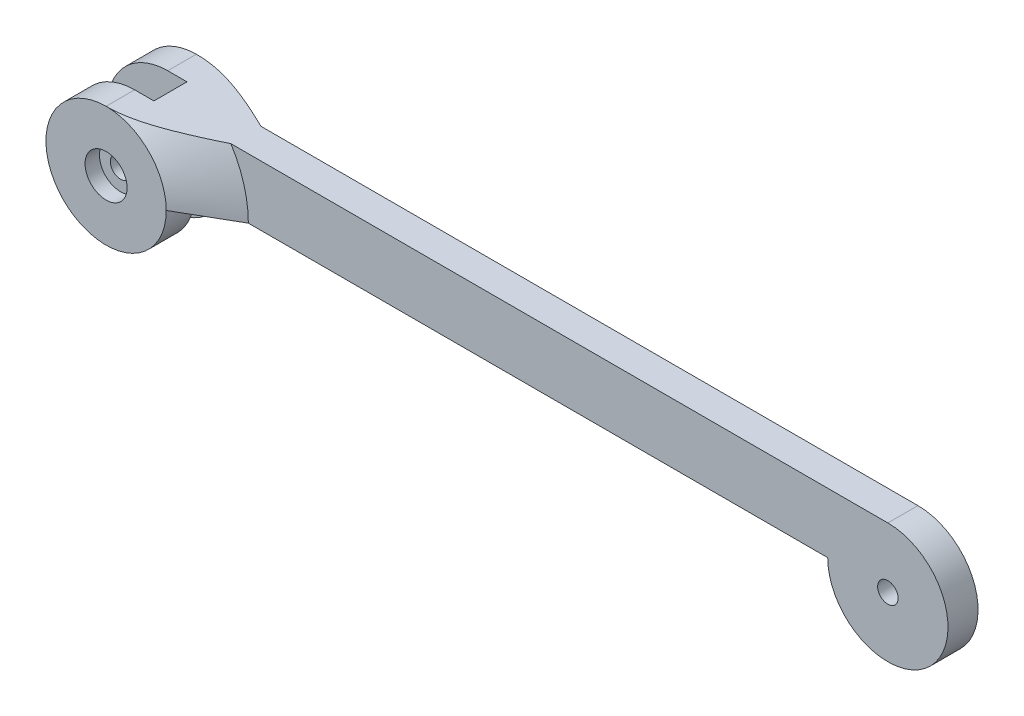
ISO-10303-21;
HEADER;
FILE_DESCRIPTION(('STEP AP214'),'2;1');
FILE_NAME('part.step','',(''),(''),'','','');
FILE_SCHEMA(('AUTOMOTIVE_DESIGN { 1 0 10303 214 1 1 1 1 }'));
ENDSEC;
DATA;
#1=APPLICATION_CONTEXT('core data for automotive mechanical design processes');
#2=APPLICATION_PROTOCOL_DEFINITION('international standard','automotive_design',2000,#1);
#3=PRODUCT_CONTEXT('',#1,'mechanical');
#4=PRODUCT('Part','Part','',(#3));
#5=PRODUCT_RELATED_PRODUCT_CATEGORY('part','',(#4));
#6=PRODUCT_DEFINITION_FORMATION('','',#4);
#7=PRODUCT_DEFINITION_CONTEXT('part definition',#1,'design');
#8=PRODUCT_DEFINITION('design','',#6,#7);
#9=PRODUCT_DEFINITION_SHAPE('','',#8);
#10=(LENGTH_UNIT() NAMED_UNIT(*) SI_UNIT(.MILLI.,.METRE.));
#11=(NAMED_UNIT(*) PLANE_ANGLE_UNIT() SI_UNIT($,.RADIAN.));
#12=(NAMED_UNIT(*) SI_UNIT($,.STERADIAN.) SOLID_ANGLE_UNIT());
#13=UNCERTAINTY_MEASURE_WITH_UNIT(LENGTH_MEASURE(1.E-05),#10,'distance_accuracy_value','');
#14=(GEOMETRIC_REPRESENTATION_CONTEXT(3) GLOBAL_UNCERTAINTY_ASSIGNED_CONTEXT((#13)) GLOBAL_UNIT_ASSIGNED_CONTEXT((#10,
#11,#12)) REPRESENTATION_CONTEXT('',''));
#15=CARTESIAN_POINT('',(0.,0.,0.));
#16=DIRECTION('',(0.,0.,1.));
#17=DIRECTION('',(1.,0.,0.));
#18=AXIS2_PLACEMENT_3D('',#15,#16,#17);
#19=CARTESIAN_POINT('',(0.,0.,7.5));
#20=DIRECTION('',(0.,0.,1.));
#21=DIRECTION('',(1.,0.,0.));
#22=AXIS2_PLACEMENT_3D('',#19,#20,#21);
#23=CYLINDRICAL_SURFACE('',#22,1.7);
#24=CARTESIAN_POINT('',(0.,0.,-2.75));
#25=DIRECTION('',(0.,0.,1.));
#26=DIRECTION('',(1.,0.,0.));
#27=AXIS2_PLACEMENT_3D('',#24,#25,#26);
#28=CIRCLE('',#27,1.7);
#29=CARTESIAN_POINT('',(1.7,0.,-2.75));
#30=VERTEX_POINT('',#29);
#31=EDGE_CURVE('E216',#30,#30,#28,.T.);
#32=ORIENTED_EDGE('',*,*,#31,.T.);
#33=EDGE_LOOP('',(#32));
#34=FACE_BOUND('',#33,.T.);
#35=CARTESIAN_POINT('',(0.,0.,-4.5));
#36=DIRECTION('',(0.,0.,-1.));
#37=DIRECTION('',(-1.,0.,0.));
#38=AXIS2_PLACEMENT_3D('',#35,#36,#37);
#39=CIRCLE('',#38,1.7);
#40=CARTESIAN_POINT('',(-1.7,0.,-4.5));
#41=VERTEX_POINT('',#40);
#42=EDGE_CURVE('E38',#41,#41,#39,.F.);
#43=ORIENTED_EDGE('',*,*,#42,.F.);
#44=EDGE_LOOP('',(#43));
#45=FACE_BOUND('',#44,.T.);
#46=ADVANCED_FACE('F33',(#34,#45),#23,.F.);
#47=CARTESIAN_POINT('',(0.,0.,2.5));
#48=DIRECTION('',(0.,0.,-1.));
#49=DIRECTION('',(-1.,0.,0.));
#50=AXIS2_PLACEMENT_3D('',#47,#48,#49);
#51=CYLINDRICAL_SURFACE('',#50,10.);
#52=CARTESIAN_POINT('',(0.,0.,-2.75));
#53=DIRECTION('',(0.,0.,1.));
#54=DIRECTION('',(1.,0.,0.));
#55=AXIS2_PLACEMENT_3D('',#52,#53,#54);
#56=CIRCLE('',#55,10.);
#57=CARTESIAN_POINT('',(0.,10.,-2.75));
#58=VERTEX_POINT('',#57);
#59=CARTESIAN_POINT('',(10.,0.,-2.75));
#60=VERTEX_POINT('',#59);
#61=EDGE_CURVE('E229',#58,#60,#56,.T.);
#62=ORIENTED_EDGE('',*,*,#61,.F.);
#63=DIRECTION('',(0.,0.,-1.));
#64=VECTOR('',#63,1.);
#65=CARTESIAN_POINT('',(0.,10.,2.5));
#66=LINE('',#65,#64);
#67=CARTESIAN_POINT('',(0.,10.,-7.5));
#68=VERTEX_POINT('',#67);
#69=EDGE_CURVE('E253',#58,#68,#66,.T.);
#70=ORIENTED_EDGE('',*,*,#69,.T.);
#71=CARTESIAN_POINT('',(0.,0.,-7.5));
#72=DIRECTION('',(0.,0.,1.));
#73=DIRECTION('',(1.,0.,0.));
#74=AXIS2_PLACEMENT_3D('',#71,#72,#73);
#75=CIRCLE('',#74,10.);
#76=CARTESIAN_POINT('',(10.,0.,-7.5));
#77=VERTEX_POINT('',#76);
#78=EDGE_CURVE('E236',#68,#77,#75,.T.);
#79=ORIENTED_EDGE('',*,*,#78,.T.);
#80=DIRECTION('',(0.,0.,-1.));
#81=VECTOR('',#80,1.);
#82=CARTESIAN_POINT('',(10.,0.,2.5));
#83=LINE('',#82,#81);
#84=EDGE_CURVE('E268',#60,#77,#83,.T.);
#85=ORIENTED_EDGE('',*,*,#84,.F.);
#86=EDGE_LOOP('',(#62,#70,#79,#85));
#87=FACE_BOUND('',#86,.T.);
#88=ADVANCED_FACE('F304',(#87),#51,.T.);
#89=CARTESIAN_POINT('',(10.,0.,2.5));
#90=DIRECTION('',(0.,1.,0.));
#91=DIRECTION('',(-1.,0.,0.));
#92=AXIS2_PLACEMENT_3D('',#89,#90,#91);
#93=PLANE('',#92);
#94=DIRECTION('',(1.,0.,0.));
#95=VECTOR('',#94,1.);
#96=CARTESIAN_POINT('',(10.,0.,-2.75));
#97=LINE('',#96,#95);
#98=CARTESIAN_POINT('',(10.5,0.,-2.75));
#99=VERTEX_POINT('',#98);
#100=EDGE_CURVE('E231',#60,#99,#97,.T.);
#101=ORIENTED_EDGE('',*,*,#100,.F.);
#102=ORIENTED_EDGE('',*,*,#84,.T.);
#103=DIRECTION('',(-0.866025403784441,0.,-0.499999999999996));
#104=VECTOR('',#103,1.);
#105=CARTESIAN_POINT('',(0.,0.,-13.2735026918963));
#106=LINE('',#105,#104);
#107=CARTESIAN_POINT('',(18.6602540378446,0.,-2.5));
#108=VERTEX_POINT('',#107);
#109=EDGE_CURVE('E277',#77,#108,#106,.F.);
#110=ORIENTED_EDGE('',*,*,#109,.T.);
#111=DIRECTION('',(1.,0.,0.));
#112=VECTOR('',#111,1.);
#113=CARTESIAN_POINT('',(10.,0.,-2.5));
#114=LINE('',#113,#112);
#115=CARTESIAN_POINT('',(115.,0.,-2.5));
#116=VERTEX_POINT('',#115);
#117=EDGE_CURVE('E240',#108,#116,#114,.T.);
#118=ORIENTED_EDGE('',*,*,#117,.T.);
#119=DIRECTION('',(0.,0.,-1.));
#120=VECTOR('',#119,1.);
#121=CARTESIAN_POINT('',(115.,0.,2.5));
#122=LINE('',#121,#120);
#123=CARTESIAN_POINT('',(115.,0.,2.5));
#124=VERTEX_POINT('',#123);
#125=EDGE_CURVE('E265',#124,#116,#122,.T.);
#126=ORIENTED_EDGE('',*,*,#125,.F.);
#127=DIRECTION('',(1.,0.,0.));
#128=VECTOR('',#127,1.);
#129=CARTESIAN_POINT('',(10.,0.,2.5));
#130=LINE('',#129,#128);
#131=CARTESIAN_POINT('',(18.6602540378446,0.,2.5));
#132=VERTEX_POINT('',#131);
#133=EDGE_CURVE('E245',#132,#124,#130,.T.);
#134=ORIENTED_EDGE('',*,*,#133,.F.);
#135=DIRECTION('',(0.866025403784441,0.,-0.499999999999996));
#136=VECTOR('',#135,1.);
#137=CARTESIAN_POINT('',(0.,0.,13.2735026918963));
#138=LINE('',#137,#136);
#139=CARTESIAN_POINT('',(10.,0.,7.5));
#140=VERTEX_POINT('',#139);
#141=EDGE_CURVE('E286',#132,#140,#138,.F.);
#142=ORIENTED_EDGE('',*,*,#141,.T.);
#143=CARTESIAN_POINT('',(10.,0.,2.75));
#144=VERTEX_POINT('',#143);
#145=EDGE_CURVE('E269',#140,#144,#83,.T.);
#146=ORIENTED_EDGE('',*,*,#145,.T.);
#147=DIRECTION('',(1.,0.,0.));
#148=VECTOR('',#147,1.);
#149=CARTESIAN_POINT('',(10.,0.,2.75));
#150=LINE('',#149,#148);
#151=CARTESIAN_POINT('',(10.5,0.,2.75));
#152=VERTEX_POINT('',#151);
#153=EDGE_CURVE('E226',#144,#152,#150,.T.);
#154=ORIENTED_EDGE('',*,*,#153,.T.);
#155=DIRECTION('',(0.,0.,1.));
#156=VECTOR('',#155,1.);
#157=CARTESIAN_POINT('',(10.5,0.,-2.75));
#158=LINE('',#157,#156);
#159=EDGE_CURVE('E233',#152,#99,#158,.F.);
#160=ORIENTED_EDGE('',*,*,#159,.T.);
#161=EDGE_LOOP('',(#101,#102,#110,#118,#126,#134,#142,#146,#154,#160));
#162=FACE_BOUND('',#161,.T.);
#163=ADVANCED_FACE('F305',(#162),#93,.F.);
#164=CARTESIAN_POINT('',(125.,10.,2.5));
#165=DIRECTION('',(0.,-1.,0.));
#166=DIRECTION('',(0.,0.,-1.));
#167=AXIS2_PLACEMENT_3D('',#164,#165,#166);
#168=PLANE('',#167);
#169=DIRECTION('',(-1.,0.,0.));
#170=VECTOR('',#169,1.);
#171=CARTESIAN_POINT('',(125.,10.,-2.75));
#172=LINE('',#171,#170);
#173=CARTESIAN_POINT('',(3.20156211871643,10.,-2.75));
#174=VERTEX_POINT('',#173);
#175=EDGE_CURVE('E11',#174,#58,#172,.T.);
#176=ORIENTED_EDGE('',*,*,#175,.F.);
#177=DIRECTION('',(0.,0.,1.));
#178=VECTOR('',#177,1.);
#179=CARTESIAN_POINT('',(3.20156211871643,10.,-2.75));
#180=LINE('',#179,#178);
#181=CARTESIAN_POINT('',(3.20156211871643,10.,2.75));
#182=VERTEX_POINT('',#181);
#183=EDGE_CURVE('E43',#174,#182,#180,.T.);
#184=ORIENTED_EDGE('',*,*,#183,.T.);
#185=DIRECTION('',(-1.,0.,0.));
#186=VECTOR('',#185,1.);
#187=CARTESIAN_POINT('',(125.,10.,2.75));
#188=LINE('',#187,#186);
#189=CARTESIAN_POINT('',(0.,10.,2.75));
#190=VERTEX_POINT('',#189);
#191=EDGE_CURVE('E345',#182,#190,#188,.T.);
#192=ORIENTED_EDGE('',*,*,#191,.T.);
#193=CARTESIAN_POINT('',(0.,10.,7.5));
#194=VERTEX_POINT('',#193);
#195=EDGE_CURVE('E259',#194,#190,#66,.T.);
#196=ORIENTED_EDGE('',*,*,#195,.F.);
#197=CARTESIAN_POINT('',(0.,10.,7.50000000000006));
#198=CARTESIAN_POINT('',(0.144372162932535,10.,7.50000362350864));
#199=CARTESIAN_POINT('',(0.288738086820741,10.,7.49819440735731));
#200=CARTESIAN_POINT('',(0.577376142951994,10.,7.4909831260463));
#201=CARTESIAN_POINT('',(0.721648277774843,10.,7.48558116429262));
#202=CARTESIAN_POINT('',(1.15408162181387,10.,7.46404186439913));
#203=CARTESIAN_POINT('',(1.44199295926562,10.,7.44257105304319));
#204=CARTESIAN_POINT('',(2.01544575715142,10.,7.38615968915833));
#205=CARTESIAN_POINT('',(2.30099199007253,10.,7.35126673147127));
#206=CARTESIAN_POINT('',(2.87029353254001,10.,7.26898729313719));
#207=CARTESIAN_POINT('',(3.15404867463625,10.,7.22159966156392));
#208=CARTESIAN_POINT('',(3.71649805138243,10.,7.11605950081699));
#209=CARTESIAN_POINT('',(3.99521427935411,10.,7.05802332692339));
#210=CARTESIAN_POINT('',(4.55038271691151,10.,6.93208185523583));
#211=CARTESIAN_POINT('',(4.82683496486458,10.,6.86417672505682));
#212=CARTESIAN_POINT('',(5.6532629489847,10.,6.64734218408917));
#213=CARTESIAN_POINT('',(6.19983849099192,10.,6.48538610894802));
#214=CARTESIAN_POINT('',(7.12743693503927,10.,6.18599092872168));
#215=CARTESIAN_POINT('',(7.51060513694897,10.,6.05501560217946));
#216=CARTESIAN_POINT('',(8.2731149819681,10.,5.78228979844106));
#217=CARTESIAN_POINT('',(8.65245639295167,10.,5.64053867200415));
#218=CARTESIAN_POINT('',(9.40777351320985,10.,5.34827589721092));
#219=CARTESIAN_POINT('',(9.78374886321815,10.,5.197763326292));
#220=CARTESIAN_POINT('',(10.5327609746539,10.,4.88958863879194));
#221=CARTESIAN_POINT('',(10.9057976587689,10.,4.73192633484336));
#222=CARTESIAN_POINT('',(11.6552149199501,10.,4.40819081914932));
#223=CARTESIAN_POINT('',(12.0315549291968,10.,4.24202396195384));
#224=CARTESIAN_POINT('',(12.7819919683187,10.,3.90469057599605));
#225=CARTESIAN_POINT('',(13.1560889529073,10.,3.73352394669529));
#226=CARTESIAN_POINT('',(13.9018689309531,10.,3.3872698917097));
#227=CARTESIAN_POINT('',(14.2735544298771,10.,3.21218785082423));
#228=CARTESIAN_POINT('',(15.0152355906283,10.,2.85854491652889));
#229=CARTESIAN_POINT('',(15.3852313704304,10.,2.67998427072209));
#230=CARTESIAN_POINT('',(15.7545257230072,10.,2.5));
#231=B_SPLINE_CURVE_WITH_KNOTS('',3,(#197,#198,#199,#200,#201,#202,#203,#204,#205,#206,#207,
#208,#209,#210,#211,#212,#213,#214,#215,#216,#217,#218,#219,#220,#221,#222,#223,#224,#225,#226,
#227,#228,#229,#230),.UNSPECIFIED.,.F.,.F.,(4,2,2,2,2,2,2,2,2,2,2,2,2,2,2,2,4),(0.,
0.433092998713906,0.86617353273196,1.73193548282355,2.59465533321231,3.45745467939441,
4.31133416707992,5.16519915411952,6.87436756328263,8.08903139061854,9.30376845940437,
10.5186336697707,11.7335307355745,12.9676628921684,14.2018198825487,15.4343728950083,
16.6668384940181),.UNSPECIFIED.);
#232=CARTESIAN_POINT('',(15.7545257230072,10.,2.5));
#233=VERTEX_POINT('',#232);
#234=EDGE_CURVE('E346',#194,#233,#231,.T.);
#235=ORIENTED_EDGE('',*,*,#234,.T.);
#236=DIRECTION('',(-1.,0.,0.));
#237=VECTOR('',#236,1.);
#238=CARTESIAN_POINT('',(125.,10.,2.5));
#239=LINE('',#238,#237);
#240=CARTESIAN_POINT('',(125.,10.,2.5));
#241=VERTEX_POINT('',#240);
#242=EDGE_CURVE('E250',#241,#233,#239,.T.);
#243=ORIENTED_EDGE('',*,*,#242,.F.);
#244=DIRECTION('',(0.,0.,-1.));
#245=VECTOR('',#244,1.);
#246=CARTESIAN_POINT('',(125.,10.,2.5));
#247=LINE('',#246,#245);
#248=CARTESIAN_POINT('',(125.,10.,-2.5));
#249=VERTEX_POINT('',#248);
#250=EDGE_CURVE('E262',#241,#249,#247,.T.);
#251=ORIENTED_EDGE('',*,*,#250,.T.);
#252=DIRECTION('',(-1.,0.,0.));
#253=VECTOR('',#252,1.);
#254=CARTESIAN_POINT('',(125.,10.,-2.5));
#255=LINE('',#254,#253);
#256=CARTESIAN_POINT('',(15.7545257230072,10.,-2.5));
#257=VERTEX_POINT('',#256);
#258=EDGE_CURVE('E248',#249,#257,#255,.T.);
#259=ORIENTED_EDGE('',*,*,#258,.T.);
#260=CARTESIAN_POINT('',(15.7545257230072,10.,-2.5));
#261=CARTESIAN_POINT('',(15.5198840277498,10.,-2.6143726576334));
#262=CARTESIAN_POINT('',(15.2849557025774,10.,-2.72815700327724));
#263=CARTESIAN_POINT('',(14.8144610410517,10.,-2.95440583419741));
#264=CARTESIAN_POINT('',(14.5788946970507,10.,-3.06687030356596));
#265=CARTESIAN_POINT('',(13.8710574592817,10.,-3.40210874934156));
#266=CARTESIAN_POINT('',(13.3977403456803,10.,-3.62268278896445));
#267=CARTESIAN_POINT('',(12.4445185620037,10.,-4.05792971284301));
#268=CARTESIAN_POINT('',(11.9645909883751,10.,-4.27255257155233));
#269=CARTESIAN_POINT('',(11.0006050517903,10.,-4.69226268364655));
#270=CARTESIAN_POINT('',(10.5165469792133,10.,-4.89735060091862));
#271=CARTESIAN_POINT('',(9.55624347848225,10.,-5.28998041498186));
#272=CARTESIAN_POINT('',(9.0801297962904,10.,-5.47784282687793));
#273=CARTESIAN_POINT('',(8.12211418853502,10.,-5.83852240737236));
#274=CARTESIAN_POINT('',(7.6402114687123,10.,-6.01133748400881));
#275=CARTESIAN_POINT('',(6.67104879639447,10.,-6.33693357362927));
#276=CARTESIAN_POINT('',(6.18380648838299,10.,-6.48976661702799));
#277=CARTESIAN_POINT('',(5.20216827509958,10.,-6.77014702199429));
#278=CARTESIAN_POINT('',(4.707775382932,10.,-6.89770471908418));
#279=CARTESIAN_POINT('',(3.86592901489965,10.,-7.08628388464164));
#280=CARTESIAN_POINT('',(3.52035328868398,10.,-7.15567972889751));
#281=CARTESIAN_POINT('',(2.82606090839637,10.,-7.27691312185407));
#282=CARTESIAN_POINT('',(2.47734417242872,10.,-7.32875021137611));
#283=CARTESIAN_POINT('',(1.95108597914763,10.,-7.39198047354064));
#284=CARTESIAN_POINT('',(1.7744015407364,10.,-7.41068295555171));
#285=CARTESIAN_POINT('',(1.4205575905147,10.,-7.44290884266521));
#286=CARTESIAN_POINT('',(1.2433980856273,10.,-7.4564323228319));
#287=CARTESIAN_POINT('',(0.888622120364232,10.,-7.47814422877479));
#288=CARTESIAN_POINT('',(0.711005420621028,10.,-7.48632874739432));
#289=CARTESIAN_POINT('',(0.355593455356932,10.,-7.49726259111322));
#290=CARTESIAN_POINT('',(0.177798178802593,10.,-7.50001155668996));
#291=CARTESIAN_POINT('',(0.,10.,-7.50000000000006));
#292=B_SPLINE_CURVE_WITH_KNOTS('',3,(#260,#261,#262,#263,#264,#265,#266,#267,#268,#269,#270,
#271,#272,#273,#274,#275,#276,#277,#278,#279,#280,#281,#282,#283,#284,#285,#286,#287,#288,#289,
#290,#291),.UNSPECIFIED.,.F.,.F.,(4,2,2,2,2,2,2,2,2,2,2,2,2,2,2,4),(0.,0.783095169291533,
1.56619976715107,3.13271611979806,4.70983164972002,6.28683720522572,7.8221538231798,
9.3576835494747,10.889131773027,12.4199524629003,13.4770083963604,14.5340919707361,
15.067043259399,15.5999868231932,16.1333199692799,16.6666883903283),.UNSPECIFIED.);
#293=EDGE_CURVE('E279',#257,#68,#292,.T.);
#294=ORIENTED_EDGE('',*,*,#293,.T.);
#295=ORIENTED_EDGE('',*,*,#69,.F.);
#296=EDGE_LOOP('',(#176,#184,#192,#196,#235,#243,#251,#259,#294,#295));
#297=FACE_BOUND('',#296,.T.);
#298=ADVANCED_FACE('F288',(#297),#168,.F.);
#299=CARTESIAN_POINT('',(0.,0.,2.5));
#300=DIRECTION('',(0.,0.,1.));
#301=DIRECTION('',(1.,0.,0.));
#302=AXIS2_PLACEMENT_3D('',#299,#300,#301);
#303=PLANE('',#302);
#304=CARTESIAN_POINT('',(125.,0.,2.5));
#305=DIRECTION('',(0.,0.,1.));
#306=DIRECTION('',(1.,0.,0.));
#307=AXIS2_PLACEMENT_3D('',#304,#305,#306);
#308=CIRCLE('',#307,1.70000000000001);
#309=CARTESIAN_POINT('',(126.7,0.,2.5));
#310=VERTEX_POINT('',#309);
#311=EDGE_CURVE('E413',#310,#310,#308,.T.);
#312=ORIENTED_EDGE('',*,*,#311,.F.);
#313=EDGE_LOOP('',(#312));
#314=FACE_BOUND('',#313,.T.);
#315=ORIENTED_EDGE('',*,*,#242,.T.);
#316=CARTESIAN_POINT('',(0.,0.,2.5));
#317=DIRECTION('',(0.,0.,1.));
#318=DIRECTION('',(1.,0.,0.));
#319=AXIS2_PLACEMENT_3D('',#316,#317,#318);
#320=CIRCLE('',#319,18.6602540378446);
#321=EDGE_CURVE('E274',#233,#132,#320,.F.);
#322=ORIENTED_EDGE('',*,*,#321,.T.);
#323=ORIENTED_EDGE('',*,*,#133,.T.);
#324=CARTESIAN_POINT('',(125.,0.,2.5));
#325=DIRECTION('',(0.,0.,1.));
#326=DIRECTION('',(-1.,0.,0.));
#327=AXIS2_PLACEMENT_3D('',#324,#325,#326);
#328=CIRCLE('',#327,10.);
#329=EDGE_CURVE('E247',#124,#241,#328,.T.);
#330=ORIENTED_EDGE('',*,*,#329,.T.);
#331=EDGE_LOOP('',(#315,#322,#323,#330));
#332=FACE_BOUND('',#331,.T.);
#333=ADVANCED_FACE('F364',(#314,#332),#303,.T.);
#334=CARTESIAN_POINT('',(0.,0.,-2.5));
#335=DIRECTION('',(0.,0.,1.));
#336=DIRECTION('',(1.,0.,0.));
#337=AXIS2_PLACEMENT_3D('',#334,#335,#336);
#338=PLANE('',#337);
#339=CARTESIAN_POINT('',(125.,0.,-2.5));
#340=DIRECTION('',(0.,0.,1.));
#341=DIRECTION('',(1.,0.,0.));
#342=AXIS2_PLACEMENT_3D('',#339,#340,#341);
#343=CIRCLE('',#342,1.70000000000001);
#344=CARTESIAN_POINT('',(126.7,0.,-2.5));
#345=VERTEX_POINT('',#344);
#346=EDGE_CURVE('E176',#345,#345,#343,.T.);
#347=ORIENTED_EDGE('',*,*,#346,.T.);
#348=EDGE_LOOP('',(#347));
#349=FACE_BOUND('',#348,.T.);
#350=ORIENTED_EDGE('',*,*,#117,.F.);
#351=CARTESIAN_POINT('',(0.,0.,-2.5));
#352=DIRECTION('',(0.,0.,1.));
#353=DIRECTION('',(1.,0.,0.));
#354=AXIS2_PLACEMENT_3D('',#351,#352,#353);
#355=CIRCLE('',#354,18.6602540378446);
#356=EDGE_CURVE('E272',#108,#257,#355,.T.);
#357=ORIENTED_EDGE('',*,*,#356,.T.);
#358=ORIENTED_EDGE('',*,*,#258,.F.);
#359=CARTESIAN_POINT('',(125.,0.,-2.5));
#360=DIRECTION('',(0.,0.,1.));
#361=DIRECTION('',(-1.,0.,0.));
#362=AXIS2_PLACEMENT_3D('',#359,#360,#361);
#363=CIRCLE('',#362,10.);
#364=EDGE_CURVE('E255',#116,#249,#363,.T.);
#365=ORIENTED_EDGE('',*,*,#364,.F.);
#366=EDGE_LOOP('',(#350,#357,#358,#365));
#367=FACE_BOUND('',#366,.T.);
#368=ADVANCED_FACE('F302',(#349,#367),#338,.F.);
#369=ORIENTED_EDGE('',*,*,#195,.T.);
#370=CARTESIAN_POINT('',(0.,0.,2.75));
#371=DIRECTION('',(0.,0.,1.));
#372=DIRECTION('',(1.,0.,0.));
#373=AXIS2_PLACEMENT_3D('',#370,#371,#372);
#374=CIRCLE('',#373,10.);
#375=EDGE_CURVE('E59',#190,#144,#374,.T.);
#376=ORIENTED_EDGE('',*,*,#375,.T.);
#377=ORIENTED_EDGE('',*,*,#145,.F.);
#378=CARTESIAN_POINT('',(0.,0.,7.5));
#379=DIRECTION('',(0.,0.,1.));
#380=DIRECTION('',(1.,0.,0.));
#381=AXIS2_PLACEMENT_3D('',#378,#379,#380);
#382=CIRCLE('',#381,10.);
#383=EDGE_CURVE('E241',#194,#140,#382,.T.);
#384=ORIENTED_EDGE('',*,*,#383,.F.);
#385=EDGE_LOOP('',(#369,#376,#377,#384));
#386=FACE_BOUND('',#385,.T.);
#387=ADVANCED_FACE('F298',(#386),#51,.T.);
#388=CARTESIAN_POINT('',(125.,0.,2.5));
#389=DIRECTION('',(0.,0.,-1.));
#390=DIRECTION('',(-1.,0.,0.));
#391=AXIS2_PLACEMENT_3D('',#388,#389,#390);
#392=CYLINDRICAL_SURFACE('',#391,10.);
#393=ORIENTED_EDGE('',*,*,#364,.T.);
#394=ORIENTED_EDGE('',*,*,#250,.F.);
#395=ORIENTED_EDGE('',*,*,#329,.F.);
#396=ORIENTED_EDGE('',*,*,#125,.T.);
#397=EDGE_LOOP('',(#393,#394,#395,#396));
#398=FACE_BOUND('',#397,.T.);
#399=ADVANCED_FACE('F301',(#398),#392,.T.);
#400=CARTESIAN_POINT('',(0.,0.,-7.5));
#401=DIRECTION('',(0.,0.,1.));
#402=DIRECTION('',(1.,0.,0.));
#403=AXIS2_PLACEMENT_3D('',#400,#401,#402);
#404=PLANE('',#403);
#405=DIRECTION('',(1.,0.,0.));
#406=VECTOR('',#405,1.);
#407=CARTESIAN_POINT('',(-1.61658075373095,2.8,-7.5));
#408=LINE('',#407,#406);
#409=CARTESIAN_POINT('',(-1.61658075373095,2.8,-7.5));
#410=VERTEX_POINT('',#409);
#411=CARTESIAN_POINT('',(1.61658075373095,2.8,-7.5));
#412=VERTEX_POINT('',#411);
#413=EDGE_CURVE('E187',#410,#412,#408,.T.);
#414=ORIENTED_EDGE('',*,*,#413,.F.);
#415=DIRECTION('',(0.5,0.866025403784438,0.));
#416=VECTOR('',#415,1.);
#417=CARTESIAN_POINT('',(-3.23316150746191,0.,-7.5));
#418=LINE('',#417,#416);
#419=CARTESIAN_POINT('',(-3.23316150746191,0.,-7.5));
#420=VERTEX_POINT('',#419);
#421=EDGE_CURVE('E51',#420,#410,#418,.T.);
#422=ORIENTED_EDGE('',*,*,#421,.F.);
#423=DIRECTION('',(-0.5,0.866025403784439,0.));
#424=VECTOR('',#423,1.);
#425=CARTESIAN_POINT('',(-1.61658075373095,-2.8,-7.5));
#426=LINE('',#425,#424);
#427=CARTESIAN_POINT('',(-1.61658075373095,-2.8,-7.5));
#428=VERTEX_POINT('',#427);
#429=EDGE_CURVE('E170',#428,#420,#426,.T.);
#430=ORIENTED_EDGE('',*,*,#429,.F.);
#431=DIRECTION('',(-1.,0.,0.));
#432=VECTOR('',#431,1.);
#433=CARTESIAN_POINT('',(1.61658075373095,-2.8,-7.5));
#434=LINE('',#433,#432);
#435=CARTESIAN_POINT('',(1.61658075373095,-2.8,-7.5));
#436=VERTEX_POINT('',#435);
#437=EDGE_CURVE('E173',#436,#428,#434,.T.);
#438=ORIENTED_EDGE('',*,*,#437,.F.);
#439=DIRECTION('',(-0.5,-0.866025403784439,0.));
#440=VECTOR('',#439,1.);
#441=CARTESIAN_POINT('',(3.2331615074619,0.,-7.5));
#442=LINE('',#441,#440);
#443=CARTESIAN_POINT('',(3.2331615074619,0.,-7.5));
#444=VERTEX_POINT('',#443);
#445=EDGE_CURVE('E192',#444,#436,#442,.T.);
#446=ORIENTED_EDGE('',*,*,#445,.F.);
#447=DIRECTION('',(0.5,-0.866025403784439,0.));
#448=VECTOR('',#447,1.);
#449=CARTESIAN_POINT('',(1.61658075373095,2.8,-7.5));
#450=LINE('',#449,#448);
#451=EDGE_CURVE('E189',#412,#444,#450,.T.);
#452=ORIENTED_EDGE('',*,*,#451,.F.);
#453=EDGE_LOOP('',(#414,#422,#430,#438,#446,#452));
#454=FACE_BOUND('',#453,.T.);
#455=EDGE_CURVE('E242',#77,#68,#75,.T.);
#456=ORIENTED_EDGE('',*,*,#455,.F.);
#457=ORIENTED_EDGE('',*,*,#78,.F.);
#458=EDGE_LOOP('',(#456,#457));
#459=FACE_BOUND('',#458,.T.);
#460=ADVANCED_FACE('F309',(#454,#459),#404,.F.);
#461=CARTESIAN_POINT('',(0.,0.,7.5));
#462=DIRECTION('',(0.,0.,1.));
#463=DIRECTION('',(1.,0.,0.));
#464=AXIS2_PLACEMENT_3D('',#461,#462,#463);
#465=PLANE('',#464);
#466=CARTESIAN_POINT('',(0.,0.,7.5));
#467=DIRECTION('',(0.,0.,1.));
#468=DIRECTION('',(1.,0.,0.));
#469=AXIS2_PLACEMENT_3D('',#466,#467,#468);
#470=CIRCLE('',#469,3.5);
#471=CARTESIAN_POINT('',(3.5,0.,7.5));
#472=VERTEX_POINT('',#471);
#473=EDGE_CURVE('E206',#472,#472,#470,.T.);
#474=ORIENTED_EDGE('',*,*,#473,.F.);
#475=EDGE_LOOP('',(#474));
#476=FACE_BOUND('',#475,.T.);
#477=EDGE_CURVE('E237',#140,#194,#382,.T.);
#478=ORIENTED_EDGE('',*,*,#477,.T.);
#479=ORIENTED_EDGE('',*,*,#383,.T.);
#480=EDGE_LOOP('',(#478,#479));
#481=FACE_BOUND('',#480,.T.);
#482=ADVANCED_FACE('F296',(#476,#481),#465,.T.);
#483=CARTESIAN_POINT('',(0.,0.,-7.50000000000006));
#484=DIRECTION('',(0.,0.,1.));
#485=DIRECTION('',(1.,0.,0.));
#486=AXIS2_PLACEMENT_3D('',#483,#484,#485);
#487=CONICAL_SURFACE('',#486,10.,1.0471975511966);
#488=ORIENTED_EDGE('',*,*,#293,.F.);
#489=ORIENTED_EDGE('',*,*,#356,.F.);
#490=ORIENTED_EDGE('',*,*,#109,.F.);
#491=ORIENTED_EDGE('',*,*,#455,.T.);
#492=EDGE_LOOP('',(#488,#489,#490,#491));
#493=FACE_BOUND('',#492,.T.);
#494=ADVANCED_FACE('F292',(#493),#487,.T.);
#495=CARTESIAN_POINT('',(0.,0.,2.5));
#496=DIRECTION('',(0.,0.,-1.));
#497=DIRECTION('',(-1.,0.,0.));
#498=AXIS2_PLACEMENT_3D('',#495,#496,#497);
#499=CONICAL_SURFACE('',#498,18.6602540378446,1.0471975511966);
#500=ORIENTED_EDGE('',*,*,#234,.F.);
#501=ORIENTED_EDGE('',*,*,#477,.F.);
#502=ORIENTED_EDGE('',*,*,#141,.F.);
#503=ORIENTED_EDGE('',*,*,#321,.F.);
#504=EDGE_LOOP('',(#500,#501,#502,#503));
#505=FACE_BOUND('',#504,.T.);
#506=ADVANCED_FACE('F35',(#505),#499,.T.);
#507=CARTESIAN_POINT('',(0.,0.,-2.75));
#508=DIRECTION('',(0.,0.,1.));
#509=DIRECTION('',(1.,0.,0.));
#510=AXIS2_PLACEMENT_3D('',#507,#508,#509);
#511=CYLINDRICAL_SURFACE('',#510,10.5);
#512=CARTESIAN_POINT('',(0.,0.,2.75));
#513=DIRECTION('',(0.,0.,1.));
#514=DIRECTION('',(1.,0.,0.));
#515=AXIS2_PLACEMENT_3D('',#512,#513,#514);
#516=CIRCLE('',#515,10.5);
#517=EDGE_CURVE('E219',#152,#182,#516,.T.);
#518=ORIENTED_EDGE('',*,*,#517,.T.);
#519=ORIENTED_EDGE('',*,*,#183,.F.);
#520=CARTESIAN_POINT('',(0.,0.,-2.75));
#521=DIRECTION('',(0.,0.,1.));
#522=DIRECTION('',(1.,0.,0.));
#523=AXIS2_PLACEMENT_3D('',#520,#521,#522);
#524=CIRCLE('',#523,10.5);
#525=EDGE_CURVE('E220',#99,#174,#524,.T.);
#526=ORIENTED_EDGE('',*,*,#525,.F.);
#527=ORIENTED_EDGE('',*,*,#159,.F.);
#528=EDGE_LOOP('',(#518,#519,#526,#527));
#529=FACE_BOUND('',#528,.T.);
#530=ADVANCED_FACE('F387',(#529),#511,.F.);
#531=CARTESIAN_POINT('',(0.,0.,-2.75));
#532=DIRECTION('',(0.,0.,1.));
#533=DIRECTION('',(1.,0.,0.));
#534=AXIS2_PLACEMENT_3D('',#531,#532,#533);
#535=PLANE('',#534);
#536=ORIENTED_EDGE('',*,*,#31,.F.);
#537=EDGE_LOOP('',(#536));
#538=FACE_BOUND('',#537,.T.);
#539=ORIENTED_EDGE('',*,*,#100,.T.);
#540=ORIENTED_EDGE('',*,*,#525,.T.);
#541=ORIENTED_EDGE('',*,*,#175,.T.);
#542=ORIENTED_EDGE('',*,*,#61,.T.);
#543=EDGE_LOOP('',(#539,#540,#541,#542));
#544=FACE_BOUND('',#543,.T.);
#545=ADVANCED_FACE('F383',(#538,#544),#535,.T.);
#546=CARTESIAN_POINT('',(0.,0.,2.75));
#547=DIRECTION('',(0.,0.,1.));
#548=DIRECTION('',(1.,0.,0.));
#549=AXIS2_PLACEMENT_3D('',#546,#547,#548);
#550=PLANE('',#549);
#551=CARTESIAN_POINT('',(0.,0.,2.75));
#552=DIRECTION('',(0.,0.,1.));
#553=DIRECTION('',(1.,0.,0.));
#554=AXIS2_PLACEMENT_3D('',#551,#552,#553);
#555=CIRCLE('',#554,1.7);
#556=CARTESIAN_POINT('',(1.7,0.,2.75));
#557=VERTEX_POINT('',#556);
#558=EDGE_CURVE('E215',#557,#557,#555,.T.);
#559=ORIENTED_EDGE('',*,*,#558,.T.);
#560=EDGE_LOOP('',(#559));
#561=FACE_BOUND('',#560,.T.);
#562=ORIENTED_EDGE('',*,*,#375,.F.);
#563=ORIENTED_EDGE('',*,*,#191,.F.);
#564=ORIENTED_EDGE('',*,*,#517,.F.);
#565=ORIENTED_EDGE('',*,*,#153,.F.);
#566=EDGE_LOOP('',(#562,#563,#564,#565));
#567=FACE_BOUND('',#566,.T.);
#568=ADVANCED_FACE('F388',(#561,#567),#550,.F.);
#569=CARTESIAN_POINT('',(0.,0.,7.5));
#570=DIRECTION('',(0.,0.,1.));
#571=DIRECTION('',(1.,0.,0.));
#572=AXIS2_PLACEMENT_3D('',#569,#570,#571);
#573=CYLINDRICAL_SURFACE('',#572,3.5);
#574=CARTESIAN_POINT('',(0.,0.,5.1));
#575=DIRECTION('',(0.,0.,1.));
#576=DIRECTION('',(1.,0.,0.));
#577=AXIS2_PLACEMENT_3D('',#574,#575,#576);
#578=CIRCLE('',#577,3.5);
#579=CARTESIAN_POINT('',(3.5,0.,5.1));
#580=VERTEX_POINT('',#579);
#581=EDGE_CURVE('E209',#580,#580,#578,.T.);
#582=ORIENTED_EDGE('',*,*,#581,.F.);
#583=EDGE_LOOP('',(#582));
#584=FACE_BOUND('',#583,.T.);
#585=ORIENTED_EDGE('',*,*,#473,.T.);
#586=EDGE_LOOP('',(#585));
#587=FACE_BOUND('',#586,.T.);
#588=ADVANCED_FACE('F335',(#584,#587),#573,.F.);
#589=CARTESIAN_POINT('',(1.7,0.,5.1));
#590=DIRECTION('',(0.,0.,-1.));
#591=DIRECTION('',(-1.,0.,0.));
#592=AXIS2_PLACEMENT_3D('',#589,#590,#591);
#593=PLANE('',#592);
#594=CARTESIAN_POINT('',(0.,0.,5.1));
#595=DIRECTION('',(0.,0.,1.));
#596=DIRECTION('',(1.,0.,0.));
#597=AXIS2_PLACEMENT_3D('',#594,#595,#596);
#598=CIRCLE('',#597,1.7);
#599=CARTESIAN_POINT('',(1.7,0.,5.1));
#600=VERTEX_POINT('',#599);
#601=EDGE_CURVE('E212',#600,#600,#598,.T.);
#602=ORIENTED_EDGE('',*,*,#601,.F.);
#603=EDGE_LOOP('',(#602));
#604=FACE_BOUND('',#603,.T.);
#605=ORIENTED_EDGE('',*,*,#581,.T.);
#606=EDGE_LOOP('',(#605));
#607=FACE_BOUND('',#606,.T.);
#608=ADVANCED_FACE('F328',(#604,#607),#593,.F.);
#609=ORIENTED_EDGE('',*,*,#601,.T.);
#610=EDGE_LOOP('',(#609));
#611=FACE_BOUND('',#610,.T.);
#612=ORIENTED_EDGE('',*,*,#558,.F.);
#613=EDGE_LOOP('',(#612));
#614=FACE_BOUND('',#613,.T.);
#615=ADVANCED_FACE('F319',(#611,#614),#23,.F.);
#616=CARTESIAN_POINT('',(0.,0.,-4.5));
#617=DIRECTION('',(0.,0.,-1.));
#618=DIRECTION('',(-1.,0.,0.));
#619=AXIS2_PLACEMENT_3D('',#616,#617,#618);
#620=PLANE('',#619);
#621=DIRECTION('',(0.5,0.866025403784438,0.));
#622=VECTOR('',#621,1.);
#623=CARTESIAN_POINT('',(-3.23316150746191,0.,-4.5));
#624=LINE('',#623,#622);
#625=CARTESIAN_POINT('',(-3.23316150746191,0.,-4.5));
#626=VERTEX_POINT('',#625);
#627=CARTESIAN_POINT('',(-1.61658075373095,2.8,-4.5));
#628=VERTEX_POINT('',#627);
#629=EDGE_CURVE('E150',#626,#628,#624,.T.);
#630=ORIENTED_EDGE('',*,*,#629,.T.);
#631=DIRECTION('',(1.,0.,0.));
#632=VECTOR('',#631,1.);
#633=CARTESIAN_POINT('',(-1.61658075373095,2.8,-4.5));
#634=LINE('',#633,#632);
#635=CARTESIAN_POINT('',(1.61658075373095,2.8,-4.5));
#636=VERTEX_POINT('',#635);
#637=EDGE_CURVE('E159',#628,#636,#634,.T.);
#638=ORIENTED_EDGE('',*,*,#637,.T.);
#639=DIRECTION('',(0.5,-0.866025403784439,0.));
#640=VECTOR('',#639,1.);
#641=CARTESIAN_POINT('',(1.61658075373095,2.8,-4.5));
#642=LINE('',#641,#640);
#643=CARTESIAN_POINT('',(3.2331615074619,0.,-4.5));
#644=VERTEX_POINT('',#643);
#645=EDGE_CURVE('E164',#636,#644,#642,.T.);
#646=ORIENTED_EDGE('',*,*,#645,.T.);
#647=DIRECTION('',(-0.5,-0.866025403784439,0.));
#648=VECTOR('',#647,1.);
#649=CARTESIAN_POINT('',(3.2331615074619,0.,-4.5));
#650=LINE('',#649,#648);
#651=CARTESIAN_POINT('',(1.61658075373095,-2.8,-4.5));
#652=VERTEX_POINT('',#651);
#653=EDGE_CURVE('E180',#644,#652,#650,.T.);
#654=ORIENTED_EDGE('',*,*,#653,.T.);
#655=DIRECTION('',(-1.,0.,0.));
#656=VECTOR('',#655,1.);
#657=CARTESIAN_POINT('',(1.61658075373095,-2.8,-4.5));
#658=LINE('',#657,#656);
#659=CARTESIAN_POINT('',(-1.61658075373095,-2.8,-4.5));
#660=VERTEX_POINT('',#659);
#661=EDGE_CURVE('E183',#652,#660,#658,.T.);
#662=ORIENTED_EDGE('',*,*,#661,.T.);
#663=DIRECTION('',(-0.5,0.866025403784439,0.));
#664=VECTOR('',#663,1.);
#665=CARTESIAN_POINT('',(-1.61658075373095,-2.8,-4.5));
#666=LINE('',#665,#664);
#667=EDGE_CURVE('E156',#660,#626,#666,.T.);
#668=ORIENTED_EDGE('',*,*,#667,.T.);
#669=EDGE_LOOP('',(#630,#638,#646,#654,#662,#668));
#670=FACE_BOUND('',#669,.T.);
#671=ORIENTED_EDGE('',*,*,#42,.T.);
#672=EDGE_LOOP('',(#671));
#673=FACE_BOUND('',#672,.T.);
#674=ADVANCED_FACE('F166',(#670,#673),#620,.T.);
#675=CARTESIAN_POINT('',(-3.23316150746191,0.,-4.5));
#676=DIRECTION('',(-0.866025403784438,0.5,0.));
#677=DIRECTION('',(-0.5,-0.866025403784438,0.));
#678=AXIS2_PLACEMENT_3D('',#675,#676,#677);
#679=PLANE('',#678);
#680=ORIENTED_EDGE('',*,*,#421,.T.);
#681=DIRECTION('',(0.,0.,-1.));
#682=VECTOR('',#681,1.);
#683=CARTESIAN_POINT('',(-1.61658075373095,2.8,-4.5));
#684=LINE('',#683,#682);
#685=EDGE_CURVE('E146',#628,#410,#684,.T.);
#686=ORIENTED_EDGE('',*,*,#685,.F.);
#687=ORIENTED_EDGE('',*,*,#629,.F.);
#688=DIRECTION('',(0.,0.,-1.));
#689=VECTOR('',#688,1.);
#690=CARTESIAN_POINT('',(-3.23316150746191,0.,-4.5));
#691=LINE('',#690,#689);
#692=EDGE_CURVE('E197',#626,#420,#691,.T.);
#693=ORIENTED_EDGE('',*,*,#692,.T.);
#694=EDGE_LOOP('',(#680,#686,#687,#693));
#695=FACE_BOUND('',#694,.T.);
#696=ADVANCED_FACE('F148',(#695),#679,.F.);
#697=CARTESIAN_POINT('',(-1.61658075373095,-2.8,-4.5));
#698=DIRECTION('',(-0.866025403784439,-0.5,0.));
#699=DIRECTION('',(0.5,-0.866025403784439,0.));
#700=AXIS2_PLACEMENT_3D('',#697,#698,#699);
#701=PLANE('',#700);
#702=ORIENTED_EDGE('',*,*,#429,.T.);
#703=ORIENTED_EDGE('',*,*,#692,.F.);
#704=ORIENTED_EDGE('',*,*,#667,.F.);
#705=DIRECTION('',(0.,0.,-1.));
#706=VECTOR('',#705,1.);
#707=CARTESIAN_POINT('',(-1.61658075373095,-2.8,-4.5));
#708=LINE('',#707,#706);
#709=EDGE_CURVE('E199',#660,#428,#708,.T.);
#710=ORIENTED_EDGE('',*,*,#709,.T.);
#711=EDGE_LOOP('',(#702,#703,#704,#710));
#712=FACE_BOUND('',#711,.T.);
#713=ADVANCED_FACE('F426',(#712),#701,.F.);
#714=CARTESIAN_POINT('',(1.61658075373095,-2.8,-4.5));
#715=DIRECTION('',(0.,-1.,0.));
#716=DIRECTION('',(0.,0.,-1.));
#717=AXIS2_PLACEMENT_3D('',#714,#715,#716);
#718=PLANE('',#717);
#719=ORIENTED_EDGE('',*,*,#437,.T.);
#720=ORIENTED_EDGE('',*,*,#709,.F.);
#721=ORIENTED_EDGE('',*,*,#661,.F.);
#722=DIRECTION('',(0.,0.,-1.));
#723=VECTOR('',#722,1.);
#724=CARTESIAN_POINT('',(1.61658075373095,-2.8,-4.5));
#725=LINE('',#724,#723);
#726=EDGE_CURVE('E201',#652,#436,#725,.T.);
#727=ORIENTED_EDGE('',*,*,#726,.T.);
#728=EDGE_LOOP('',(#719,#720,#721,#727));
#729=FACE_BOUND('',#728,.T.);
#730=ADVANCED_FACE('F429',(#729),#718,.F.);
#731=CARTESIAN_POINT('',(3.2331615074619,0.,-4.5));
#732=DIRECTION('',(0.866025403784438,-0.5,0.));
#733=DIRECTION('',(0.5,0.866025403784439,0.));
#734=AXIS2_PLACEMENT_3D('',#731,#732,#733);
#735=PLANE('',#734);
#736=ORIENTED_EDGE('',*,*,#445,.T.);
#737=ORIENTED_EDGE('',*,*,#726,.F.);
#738=ORIENTED_EDGE('',*,*,#653,.F.);
#739=DIRECTION('',(0.,0.,-1.));
#740=VECTOR('',#739,1.);
#741=CARTESIAN_POINT('',(3.2331615074619,0.,-4.5));
#742=LINE('',#741,#740);
#743=EDGE_CURVE('E203',#644,#444,#742,.T.);
#744=ORIENTED_EDGE('',*,*,#743,.T.);
#745=EDGE_LOOP('',(#736,#737,#738,#744));
#746=FACE_BOUND('',#745,.T.);
#747=ADVANCED_FACE('F433',(#746),#735,.F.);
#748=CARTESIAN_POINT('',(1.61658075373095,2.8,-4.5));
#749=DIRECTION('',(0.866025403784438,0.5,0.));
#750=DIRECTION('',(-0.5,0.866025403784439,0.));
#751=AXIS2_PLACEMENT_3D('',#748,#749,#750);
#752=PLANE('',#751);
#753=ORIENTED_EDGE('',*,*,#451,.T.);
#754=ORIENTED_EDGE('',*,*,#743,.F.);
#755=ORIENTED_EDGE('',*,*,#645,.F.);
#756=DIRECTION('',(0.,0.,-1.));
#757=VECTOR('',#756,1.);
#758=CARTESIAN_POINT('',(1.61658075373095,2.8,-4.5));
#759=LINE('',#758,#757);
#760=EDGE_CURVE('E155',#636,#412,#759,.T.);
#761=ORIENTED_EDGE('',*,*,#760,.T.);
#762=EDGE_LOOP('',(#753,#754,#755,#761));
#763=FACE_BOUND('',#762,.T.);
#764=ADVANCED_FACE('F423',(#763),#752,.F.);
#765=CARTESIAN_POINT('',(-1.61658075373095,2.8,-4.5));
#766=DIRECTION('',(0.,1.,0.));
#767=DIRECTION('',(-1.,0.,0.));
#768=AXIS2_PLACEMENT_3D('',#765,#766,#767);
#769=PLANE('',#768);
#770=ORIENTED_EDGE('',*,*,#413,.T.);
#771=ORIENTED_EDGE('',*,*,#760,.F.);
#772=ORIENTED_EDGE('',*,*,#637,.F.);
#773=ORIENTED_EDGE('',*,*,#685,.T.);
#774=EDGE_LOOP('',(#770,#771,#772,#773));
#775=FACE_BOUND('',#774,.T.);
#776=ADVANCED_FACE('F160',(#775),#769,.F.);
#777=CARTESIAN_POINT('',(125.,0.,2.5));
#778=DIRECTION('',(0.,0.,1.));
#779=DIRECTION('',(1.,0.,0.));
#780=AXIS2_PLACEMENT_3D('',#777,#778,#779);
#781=CYLINDRICAL_SURFACE('',#780,1.70000000000001);
#782=ORIENTED_EDGE('',*,*,#346,.F.);
#783=EDGE_LOOP('',(#782));
#784=FACE_BOUND('',#783,.T.);
#785=ORIENTED_EDGE('',*,*,#311,.T.);
#786=EDGE_LOOP('',(#785));
#787=FACE_BOUND('',#786,.T.);
#788=ADVANCED_FACE('F417',(#784,#787),#781,.F.);
#789=CLOSED_SHELL('',(#46,#88,#163,#298,#333,#368,#387,#399,#460,#482,#494,#506,#530,#545,#568,
#588,#608,#615,#674,#696,#713,#730,#747,#764,#776,#788));
#790=MANIFOLD_SOLID_BREP('B2',#789);
#791=ADVANCED_BREP_SHAPE_REPRESENTATION('',(#18,#790),#14);
#792=SHAPE_DEFINITION_REPRESENTATION(#9,#791);
ENDSEC;
END-ISO-10303-21;
